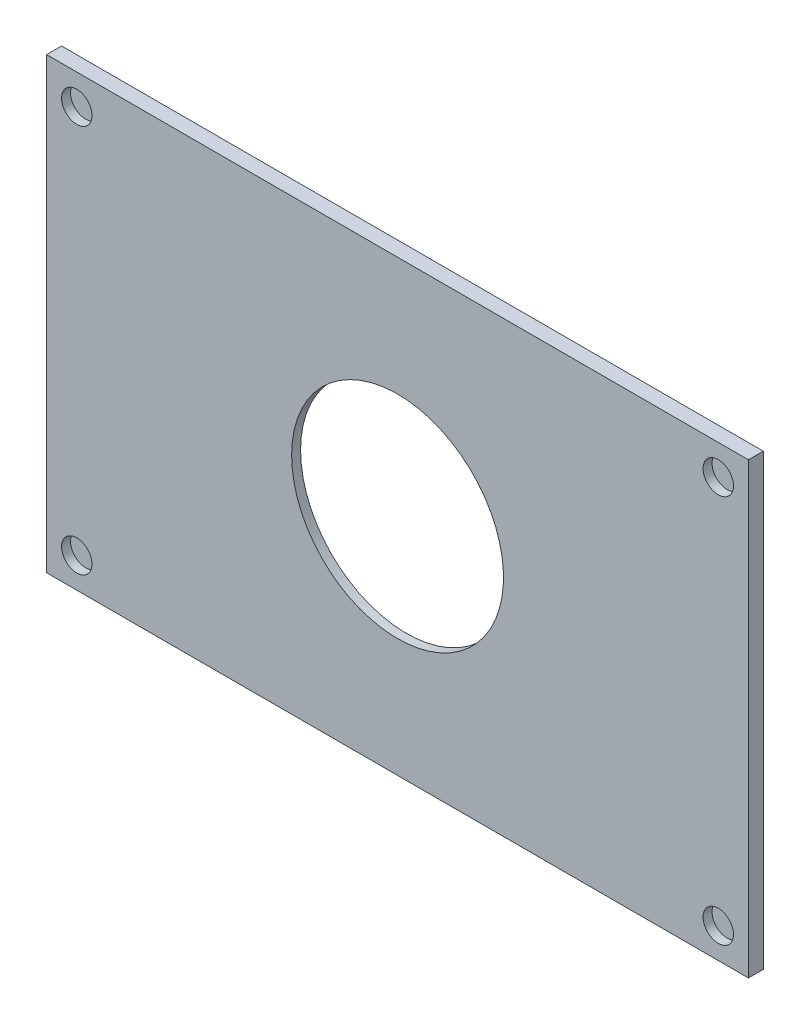
ISO-10303-21;
HEADER;
FILE_DESCRIPTION(('STEP AP214'),'2;1');
FILE_NAME('part.step','',(''),(''),'','','');
FILE_SCHEMA(('AUTOMOTIVE_DESIGN { 1 0 10303 214 1 1 1 1 }'));
ENDSEC;
DATA;
#1=APPLICATION_CONTEXT('core data for automotive mechanical design processes');
#2=APPLICATION_PROTOCOL_DEFINITION('international standard','automotive_design',2000,#1);
#3=PRODUCT_CONTEXT('',#1,'mechanical');
#4=PRODUCT('Part','Part','',(#3));
#5=PRODUCT_RELATED_PRODUCT_CATEGORY('part','',(#4));
#6=PRODUCT_DEFINITION_FORMATION('','',#4);
#7=PRODUCT_DEFINITION_CONTEXT('part definition',#1,'design');
#8=PRODUCT_DEFINITION('design','',#6,#7);
#9=PRODUCT_DEFINITION_SHAPE('','',#8);
#10=(LENGTH_UNIT() NAMED_UNIT(*) SI_UNIT(.MILLI.,.METRE.));
#11=(NAMED_UNIT(*) PLANE_ANGLE_UNIT() SI_UNIT($,.RADIAN.));
#12=(NAMED_UNIT(*) SI_UNIT($,.STERADIAN.) SOLID_ANGLE_UNIT());
#13=UNCERTAINTY_MEASURE_WITH_UNIT(LENGTH_MEASURE(1.E-05),#10,'distance_accuracy_value','');
#14=(GEOMETRIC_REPRESENTATION_CONTEXT(3) GLOBAL_UNCERTAINTY_ASSIGNED_CONTEXT((#13)) GLOBAL_UNIT_ASSIGNED_CONTEXT((#10,
#11,#12)) REPRESENTATION_CONTEXT('',''));
#15=CARTESIAN_POINT('',(0.,0.,0.));
#16=DIRECTION('',(0.,0.,1.));
#17=DIRECTION('',(1.,0.,0.));
#18=AXIS2_PLACEMENT_3D('',#15,#16,#17);
#19=CARTESIAN_POINT('',(0.,0.,0.));
#20=DIRECTION('',(0.,0.,1.));
#21=DIRECTION('',(1.,0.,0.));
#22=AXIS2_PLACEMENT_3D('',#19,#20,#21);
#23=PLANE('',#22);
#24=CARTESIAN_POINT('',(149.352,-95.5039999999999,0.));
#25=DIRECTION('',(0.,0.,1.));
#26=DIRECTION('',(1.,0.,0.));
#27=AXIS2_PLACEMENT_3D('',#24,#25,#26);
#28=CIRCLE('',#27,45.085);
#29=CARTESIAN_POINT('',(104.267,-95.5039999999999,0.));
#30=VERTEX_POINT('',#29);
#31=EDGE_CURVE('E101',#30,#30,#28,.T.);
#32=ORIENTED_EDGE('',*,*,#31,.T.);
#33=EDGE_LOOP('',(#32));
#34=FACE_BOUND('',#33,.T.);
#35=CARTESIAN_POINT('',(149.352,-95.5039999999999,0.));
#36=DIRECTION('',(0.,0.,1.));
#37=DIRECTION('',(1.,0.,0.));
#38=AXIS2_PLACEMENT_3D('',#35,#36,#37);
#39=CIRCLE('',#38,50.165);
#40=CARTESIAN_POINT('',(199.517,-95.5039999999999,0.));
#41=VERTEX_POINT('',#40);
#42=EDGE_CURVE('E95',#41,#41,#39,.T.);
#43=ORIENTED_EDGE('',*,*,#42,.F.);
#44=EDGE_LOOP('',(#43));
#45=FACE_BOUND('',#44,.T.);
#46=ADVANCED_FACE('F33',(#34,#45),#23,.F.);
#47=CARTESIAN_POINT('',(0.,0.,3.81));
#48=DIRECTION('',(0.,0.,1.));
#49=DIRECTION('',(1.,0.,0.));
#50=AXIS2_PLACEMENT_3D('',#47,#48,#49);
#51=PLANE('',#50);
#52=CARTESIAN_POINT('',(12.827,-178.181,3.81));
#53=DIRECTION('',(0.,0.,1.));
#54=DIRECTION('',(1.,0.,0.));
#55=AXIS2_PLACEMENT_3D('',#52,#53,#54);
#56=CIRCLE('',#55,6.477);
#57=CARTESIAN_POINT('',(6.34999999999998,-178.181,3.81));
#58=VERTEX_POINT('',#57);
#59=EDGE_CURVE('E108',#58,#58,#56,.T.);
#60=ORIENTED_EDGE('',*,*,#59,.F.);
#61=EDGE_LOOP('',(#60));
#62=FACE_BOUND('',#61,.T.);
#63=CARTESIAN_POINT('',(285.877,-12.8269999999999,3.81));
#64=DIRECTION('',(0.,0.,1.));
#65=DIRECTION('',(1.,0.,0.));
#66=AXIS2_PLACEMENT_3D('',#63,#64,#65);
#67=CIRCLE('',#66,6.47700000000001);
#68=CARTESIAN_POINT('',(279.4,-12.8269999999999,3.81));
#69=VERTEX_POINT('',#68);
#70=EDGE_CURVE('E120',#69,#69,#67,.T.);
#71=ORIENTED_EDGE('',*,*,#70,.F.);
#72=EDGE_LOOP('',(#71));
#73=FACE_BOUND('',#72,.T.);
#74=DIRECTION('',(0.,-1.,0.));
#75=VECTOR('',#74,1.);
#76=CARTESIAN_POINT('',(0.,0.,3.81));
#77=LINE('',#76,#75);
#78=CARTESIAN_POINT('',(0.,0.,3.81));
#79=VERTEX_POINT('',#78);
#80=CARTESIAN_POINT('',(0.,-191.008,3.81));
#81=VERTEX_POINT('',#80);
#82=EDGE_CURVE('E129',#79,#81,#77,.T.);
#83=ORIENTED_EDGE('',*,*,#82,.T.);
#84=DIRECTION('',(1.,0.,0.));
#85=VECTOR('',#84,1.);
#86=CARTESIAN_POINT('',(0.,-191.008,3.81));
#87=LINE('',#86,#85);
#88=CARTESIAN_POINT('',(298.704,-191.008,3.81));
#89=VERTEX_POINT('',#88);
#90=EDGE_CURVE('E133',#81,#89,#87,.T.);
#91=ORIENTED_EDGE('',*,*,#90,.T.);
#92=DIRECTION('',(0.,1.,0.));
#93=VECTOR('',#92,1.);
#94=CARTESIAN_POINT('',(298.704,0.,3.81));
#95=LINE('',#94,#93);
#96=CARTESIAN_POINT('',(298.704,0.,3.81));
#97=VERTEX_POINT('',#96);
#98=EDGE_CURVE('E53',#89,#97,#95,.T.);
#99=ORIENTED_EDGE('',*,*,#98,.T.);
#100=DIRECTION('',(-1.,0.,0.));
#101=VECTOR('',#100,1.);
#102=CARTESIAN_POINT('',(0.,0.,3.81));
#103=LINE('',#102,#101);
#104=EDGE_CURVE('E48',#97,#79,#103,.T.);
#105=ORIENTED_EDGE('',*,*,#104,.T.);
#106=EDGE_LOOP('',(#83,#91,#99,#105));
#107=FACE_BOUND('',#106,.T.);
#108=CARTESIAN_POINT('',(12.827,-12.827,3.81));
#109=DIRECTION('',(0.,0.,1.));
#110=DIRECTION('',(1.,0.,0.));
#111=AXIS2_PLACEMENT_3D('',#108,#109,#110);
#112=CIRCLE('',#111,6.477);
#113=CARTESIAN_POINT('',(6.34999999999999,-12.827,3.81));
#114=VERTEX_POINT('',#113);
#115=EDGE_CURVE('E126',#114,#114,#112,.T.);
#116=ORIENTED_EDGE('',*,*,#115,.F.);
#117=EDGE_LOOP('',(#116));
#118=FACE_BOUND('',#117,.T.);
#119=CARTESIAN_POINT('',(285.877,-178.181,3.81));
#120=DIRECTION('',(0.,0.,1.));
#121=DIRECTION('',(1.,0.,0.));
#122=AXIS2_PLACEMENT_3D('',#119,#120,#121);
#123=CIRCLE('',#122,6.47700000000001);
#124=CARTESIAN_POINT('',(279.4,-178.181,3.81));
#125=VERTEX_POINT('',#124);
#126=EDGE_CURVE('E114',#125,#125,#123,.T.);
#127=ORIENTED_EDGE('',*,*,#126,.F.);
#128=EDGE_LOOP('',(#127));
#129=FACE_BOUND('',#128,.T.);
#130=CARTESIAN_POINT('',(149.352,-95.5039999999999,3.81));
#131=DIRECTION('',(0.,0.,1.));
#132=DIRECTION('',(1.,0.,0.));
#133=AXIS2_PLACEMENT_3D('',#130,#131,#132);
#134=CIRCLE('',#133,45.085);
#135=CARTESIAN_POINT('',(104.267,-95.5039999999999,3.81));
#136=VERTEX_POINT('',#135);
#137=EDGE_CURVE('E102',#136,#136,#134,.T.);
#138=ORIENTED_EDGE('',*,*,#137,.F.);
#139=EDGE_LOOP('',(#138));
#140=FACE_BOUND('',#139,.T.);
#141=ADVANCED_FACE('F143',(#62,#73,#107,#118,#129,#140),#51,.T.);
#142=CARTESIAN_POINT('',(0.,0.,3.81));
#143=DIRECTION('',(1.,0.,0.));
#144=DIRECTION('',(0.,1.,0.));
#145=AXIS2_PLACEMENT_3D('',#142,#143,#144);
#146=PLANE('',#145);
#147=DIRECTION('',(0.,0.,-1.));
#148=VECTOR('',#147,1.);
#149=CARTESIAN_POINT('',(0.,0.,3.81));
#150=LINE('',#149,#148);
#151=CARTESIAN_POINT('',(0.,0.,-2.54));
#152=VERTEX_POINT('',#151);
#153=EDGE_CURVE('E137',#79,#152,#150,.T.);
#154=ORIENTED_EDGE('',*,*,#153,.T.);
#155=DIRECTION('',(0.,1.,0.));
#156=VECTOR('',#155,1.);
#157=CARTESIAN_POINT('',(0.,-191.008,-2.54));
#158=LINE('',#157,#156);
#159=CARTESIAN_POINT('',(0.,-191.008,-2.54));
#160=VERTEX_POINT('',#159);
#161=EDGE_CURVE('E86',#160,#152,#158,.T.);
#162=ORIENTED_EDGE('',*,*,#161,.F.);
#163=DIRECTION('',(0.,0.,-1.));
#164=VECTOR('',#163,1.);
#165=CARTESIAN_POINT('',(0.,-191.008,3.81));
#166=LINE('',#165,#164);
#167=EDGE_CURVE('E11',#81,#160,#166,.T.);
#168=ORIENTED_EDGE('',*,*,#167,.F.);
#169=ORIENTED_EDGE('',*,*,#82,.F.);
#170=EDGE_LOOP('',(#154,#162,#168,#169));
#171=FACE_BOUND('',#170,.T.);
#172=ADVANCED_FACE('F35',(#171),#146,.F.);
#173=CARTESIAN_POINT('',(0.,-191.008,3.81));
#174=DIRECTION('',(0.,1.,0.));
#175=DIRECTION('',(-1.,0.,0.));
#176=AXIS2_PLACEMENT_3D('',#173,#174,#175);
#177=PLANE('',#176);
#178=ORIENTED_EDGE('',*,*,#167,.T.);
#179=DIRECTION('',(-1.,0.,0.));
#180=VECTOR('',#179,1.);
#181=CARTESIAN_POINT('',(298.704,-191.008,-2.54));
#182=LINE('',#181,#180);
#183=CARTESIAN_POINT('',(298.704,-191.008,-2.54));
#184=VERTEX_POINT('',#183);
#185=EDGE_CURVE('E80',#184,#160,#182,.T.);
#186=ORIENTED_EDGE('',*,*,#185,.F.);
#187=DIRECTION('',(0.,0.,-1.));
#188=VECTOR('',#187,1.);
#189=CARTESIAN_POINT('',(298.704,-191.008,3.81));
#190=LINE('',#189,#188);
#191=EDGE_CURVE('E41',#89,#184,#190,.T.);
#192=ORIENTED_EDGE('',*,*,#191,.F.);
#193=ORIENTED_EDGE('',*,*,#90,.F.);
#194=EDGE_LOOP('',(#178,#186,#192,#193));
#195=FACE_BOUND('',#194,.T.);
#196=ADVANCED_FACE('F81',(#195),#177,.F.);
#197=CARTESIAN_POINT('',(298.704,0.,3.81));
#198=DIRECTION('',(-1.,0.,0.));
#199=DIRECTION('',(0.,-1.,0.));
#200=AXIS2_PLACEMENT_3D('',#197,#198,#199);
#201=PLANE('',#200);
#202=ORIENTED_EDGE('',*,*,#191,.T.);
#203=DIRECTION('',(0.,-1.,0.));
#204=VECTOR('',#203,1.);
#205=CARTESIAN_POINT('',(298.704,-191.008,-2.54));
#206=LINE('',#205,#204);
#207=CARTESIAN_POINT('',(298.704,0.,-2.54));
#208=VERTEX_POINT('',#207);
#209=EDGE_CURVE('E76',#208,#184,#206,.T.);
#210=ORIENTED_EDGE('',*,*,#209,.F.);
#211=DIRECTION('',(0.,0.,-1.));
#212=VECTOR('',#211,1.);
#213=CARTESIAN_POINT('',(298.704,0.,3.81));
#214=LINE('',#213,#212);
#215=EDGE_CURVE('E78',#97,#208,#214,.T.);
#216=ORIENTED_EDGE('',*,*,#215,.F.);
#217=ORIENTED_EDGE('',*,*,#98,.F.);
#218=EDGE_LOOP('',(#202,#210,#216,#217));
#219=FACE_BOUND('',#218,.T.);
#220=ADVANCED_FACE('F74',(#219),#201,.F.);
#221=CARTESIAN_POINT('',(0.,0.,3.81));
#222=DIRECTION('',(0.,-1.,0.));
#223=DIRECTION('',(0.,0.,-1.));
#224=AXIS2_PLACEMENT_3D('',#221,#222,#223);
#225=PLANE('',#224);
#226=ORIENTED_EDGE('',*,*,#215,.T.);
#227=DIRECTION('',(1.,0.,0.));
#228=VECTOR('',#227,1.);
#229=CARTESIAN_POINT('',(298.704,0.,-2.54));
#230=LINE('',#229,#228);
#231=EDGE_CURVE('E91',#152,#208,#230,.T.);
#232=ORIENTED_EDGE('',*,*,#231,.F.);
#233=ORIENTED_EDGE('',*,*,#153,.F.);
#234=ORIENTED_EDGE('',*,*,#104,.F.);
#235=EDGE_LOOP('',(#226,#232,#233,#234));
#236=FACE_BOUND('',#235,.T.);
#237=ADVANCED_FACE('F140',(#236),#225,.F.);
#238=CARTESIAN_POINT('',(12.827,-12.827,3.81));
#239=DIRECTION('',(0.,0.,-1.));
#240=DIRECTION('',(-1.,0.,0.));
#241=AXIS2_PLACEMENT_3D('',#238,#239,#240);
#242=CYLINDRICAL_SURFACE('',#241,6.477);
#243=CARTESIAN_POINT('',(12.827,-12.827,0.));
#244=DIRECTION('',(0.,0.,1.));
#245=DIRECTION('',(1.,0.,0.));
#246=AXIS2_PLACEMENT_3D('',#243,#244,#245);
#247=CIRCLE('',#246,6.477);
#248=CARTESIAN_POINT('',(6.34999999999999,-12.827,0.));
#249=VERTEX_POINT('',#248);
#250=EDGE_CURVE('E123',#249,#249,#247,.T.);
#251=CARTESIAN_POINT('',(6.34999999999999,-12.827,3.81));
#252=CARTESIAN_POINT('',(6.34999999999999,-12.827,3.7703125));
#253=CARTESIAN_POINT('',(6.34999999999999,-12.827,3.730625));
#254=CARTESIAN_POINT('',(6.34999999999999,-12.827,3.65125));
#255=CARTESIAN_POINT('',(6.34999999999999,-12.827,3.6115625));
#256=CARTESIAN_POINT('',(6.34999999999999,-12.827,3.5321875));
#257=CARTESIAN_POINT('',(6.34999999999999,-12.827,3.4925));
#258=CARTESIAN_POINT('',(6.34999999999999,-12.827,3.413125));
#259=CARTESIAN_POINT('',(6.34999999999999,-12.827,3.3734375));
#260=CARTESIAN_POINT('',(6.34999999999999,-12.827,3.2940625));
#261=CARTESIAN_POINT('',(6.34999999999999,-12.827,3.254375));
#262=CARTESIAN_POINT('',(6.34999999999999,-12.827,3.175));
#263=CARTESIAN_POINT('',(6.34999999999999,-12.827,3.1353125));
#264=CARTESIAN_POINT('',(6.34999999999999,-12.827,3.0559375));
#265=CARTESIAN_POINT('',(6.34999999999999,-12.827,3.01625));
#266=CARTESIAN_POINT('',(6.34999999999999,-12.827,2.936875));
#267=CARTESIAN_POINT('',(6.34999999999999,-12.827,2.8971875));
#268=CARTESIAN_POINT('',(6.34999999999999,-12.827,2.8178125));
#269=CARTESIAN_POINT('',(6.34999999999999,-12.827,2.778125));
#270=CARTESIAN_POINT('',(6.34999999999999,-12.827,2.69875));
#271=CARTESIAN_POINT('',(6.34999999999999,-12.827,2.6590625));
#272=CARTESIAN_POINT('',(6.34999999999999,-12.827,2.5796875));
#273=CARTESIAN_POINT('',(6.34999999999999,-12.827,2.54));
#274=CARTESIAN_POINT('',(6.34999999999999,-12.827,2.460625));
#275=CARTESIAN_POINT('',(6.34999999999999,-12.827,2.4209375));
#276=CARTESIAN_POINT('',(6.34999999999999,-12.827,2.3415625));
#277=CARTESIAN_POINT('',(6.34999999999999,-12.827,2.301875));
#278=CARTESIAN_POINT('',(6.34999999999999,-12.827,2.2225));
#279=CARTESIAN_POINT('',(6.34999999999999,-12.827,2.1828125));
#280=CARTESIAN_POINT('',(6.34999999999999,-12.827,2.1034375));
#281=CARTESIAN_POINT('',(6.34999999999999,-12.827,2.06375));
#282=CARTESIAN_POINT('',(6.34999999999999,-12.827,1.984375));
#283=CARTESIAN_POINT('',(6.34999999999999,-12.827,1.9446875));
#284=CARTESIAN_POINT('',(6.34999999999999,-12.827,1.8653125));
#285=CARTESIAN_POINT('',(6.34999999999999,-12.827,1.825625));
#286=CARTESIAN_POINT('',(6.34999999999999,-12.827,1.74625));
#287=CARTESIAN_POINT('',(6.34999999999999,-12.827,1.7065625));
#288=CARTESIAN_POINT('',(6.34999999999999,-12.827,1.6271875));
#289=CARTESIAN_POINT('',(6.34999999999999,-12.827,1.5875));
#290=CARTESIAN_POINT('',(6.34999999999999,-12.827,1.508125));
#291=CARTESIAN_POINT('',(6.34999999999999,-12.827,1.4684375));
#292=CARTESIAN_POINT('',(6.34999999999999,-12.827,1.3890625));
#293=CARTESIAN_POINT('',(6.34999999999999,-12.827,1.349375));
#294=CARTESIAN_POINT('',(6.34999999999999,-12.827,1.27));
#295=CARTESIAN_POINT('',(6.34999999999999,-12.827,1.2303125));
#296=CARTESIAN_POINT('',(6.34999999999999,-12.827,1.1509375));
#297=CARTESIAN_POINT('',(6.34999999999999,-12.827,1.11125));
#298=CARTESIAN_POINT('',(6.34999999999999,-12.827,1.031875));
#299=CARTESIAN_POINT('',(6.34999999999999,-12.827,0.9921875));
#300=CARTESIAN_POINT('',(6.34999999999999,-12.827,0.9128125));
#301=CARTESIAN_POINT('',(6.34999999999999,-12.827,0.873125));
#302=CARTESIAN_POINT('',(6.34999999999999,-12.827,0.79375));
#303=CARTESIAN_POINT('',(6.34999999999999,-12.827,0.7540625));
#304=CARTESIAN_POINT('',(6.34999999999999,-12.827,0.6746875));
#305=CARTESIAN_POINT('',(6.34999999999999,-12.827,0.635));
#306=CARTESIAN_POINT('',(6.34999999999999,-12.827,0.555625));
#307=CARTESIAN_POINT('',(6.34999999999999,-12.827,0.5159375));
#308=CARTESIAN_POINT('',(6.34999999999999,-12.827,0.4365625));
#309=CARTESIAN_POINT('',(6.34999999999999,-12.827,0.396875));
#310=CARTESIAN_POINT('',(6.34999999999999,-12.827,0.3175));
#311=CARTESIAN_POINT('',(6.34999999999999,-12.827,0.2778125));
#312=CARTESIAN_POINT('',(6.34999999999999,-12.827,0.1984375));
#313=CARTESIAN_POINT('',(6.34999999999999,-12.827,0.15875));
#314=CARTESIAN_POINT('',(6.34999999999999,-12.827,0.0793749999999999));
#315=CARTESIAN_POINT('',(6.34999999999999,-12.827,0.0396874999999999));
#316=CARTESIAN_POINT('',(6.34999999999999,-12.827,0.));
#317=B_SPLINE_CURVE_WITH_KNOTS('',3,(#251,#252,#253,#254,#255,#256,#257,#258,#259,#260,#261,
#262,#263,#264,#265,#266,#267,#268,#269,#270,#271,#272,#273,#274,#275,#276,#277,#278,#279,#280,
#281,#282,#283,#284,#285,#286,#287,#288,#289,#290,#291,#292,#293,#294,#295,#296,#297,#298,#299,
#300,#301,#302,#303,#304,#305,#306,#307,#308,#309,#310,#311,#312,#313,#314,#315,#316),
.UNSPECIFIED.,.F.,.F.,(4,2,2,2,2,2,2,2,2,2,2,2,2,2,2,2,2,2,2,2,2,2,2,2,2,2,2,2,2,2,2,2,4),(0.,
0.1190625,0.238125,0.3571875,0.47625,0.5953125,0.714375,0.8334375,0.9525,1.0715625,1.190625,
1.3096875,1.42875,1.5478125,1.666875,1.7859375,1.905,2.0240625,2.143125,2.2621875,2.38125,
2.5003125,2.619375,2.7384375,2.8575,2.9765625,3.095625,3.2146875,3.33375,3.4528125,3.571875,
3.6909375,3.81),.UNSPECIFIED.);
#318=EDGE_CURVE('BSEAM194',#114,#249,#317,.T.);
#319=ORIENTED_EDGE('',*,*,#115,.T.);
#320=ORIENTED_EDGE('',*,*,#250,.F.);
#321=ORIENTED_EDGE('',*,*,#318,.T.);
#322=ORIENTED_EDGE('',*,*,#318,.F.);
#323=EDGE_LOOP('',(#319,#321,#320,#322));
#324=FACE_BOUND('',#323,.T.);
#325=ADVANCED_FACE('F194',(#324),#242,.F.);
#326=CARTESIAN_POINT('',(285.877,-12.8269999999999,3.81));
#327=DIRECTION('',(0.,0.,-1.));
#328=DIRECTION('',(-1.,0.,0.));
#329=AXIS2_PLACEMENT_3D('',#326,#327,#328);
#330=CYLINDRICAL_SURFACE('',#329,6.47700000000001);
#331=CARTESIAN_POINT('',(285.877,-12.8269999999999,0.));
#332=DIRECTION('',(0.,0.,1.));
#333=DIRECTION('',(1.,0.,0.));
#334=AXIS2_PLACEMENT_3D('',#331,#332,#333);
#335=CIRCLE('',#334,6.47700000000001);
#336=CARTESIAN_POINT('',(279.4,-12.8269999999999,0.));
#337=VERTEX_POINT('',#336);
#338=EDGE_CURVE('E117',#337,#337,#335,.T.);
#339=CARTESIAN_POINT('',(279.4,-12.8269999999999,3.81));
#340=CARTESIAN_POINT('',(279.4,-12.8269999999999,3.7703125));
#341=CARTESIAN_POINT('',(279.4,-12.8269999999999,3.730625));
#342=CARTESIAN_POINT('',(279.4,-12.8269999999999,3.65125));
#343=CARTESIAN_POINT('',(279.4,-12.8269999999999,3.6115625));
#344=CARTESIAN_POINT('',(279.4,-12.8269999999999,3.5321875));
#345=CARTESIAN_POINT('',(279.4,-12.8269999999999,3.4925));
#346=CARTESIAN_POINT('',(279.4,-12.8269999999999,3.413125));
#347=CARTESIAN_POINT('',(279.4,-12.8269999999999,3.3734375));
#348=CARTESIAN_POINT('',(279.4,-12.8269999999999,3.2940625));
#349=CARTESIAN_POINT('',(279.4,-12.8269999999999,3.254375));
#350=CARTESIAN_POINT('',(279.4,-12.8269999999999,3.175));
#351=CARTESIAN_POINT('',(279.4,-12.8269999999999,3.1353125));
#352=CARTESIAN_POINT('',(279.4,-12.8269999999999,3.0559375));
#353=CARTESIAN_POINT('',(279.4,-12.8269999999999,3.01625));
#354=CARTESIAN_POINT('',(279.4,-12.8269999999999,2.936875));
#355=CARTESIAN_POINT('',(279.4,-12.8269999999999,2.8971875));
#356=CARTESIAN_POINT('',(279.4,-12.8269999999999,2.8178125));
#357=CARTESIAN_POINT('',(279.4,-12.8269999999999,2.778125));
#358=CARTESIAN_POINT('',(279.4,-12.8269999999999,2.69875));
#359=CARTESIAN_POINT('',(279.4,-12.8269999999999,2.6590625));
#360=CARTESIAN_POINT('',(279.4,-12.8269999999999,2.5796875));
#361=CARTESIAN_POINT('',(279.4,-12.8269999999999,2.54));
#362=CARTESIAN_POINT('',(279.4,-12.8269999999999,2.460625));
#363=CARTESIAN_POINT('',(279.4,-12.8269999999999,2.4209375));
#364=CARTESIAN_POINT('',(279.4,-12.8269999999999,2.3415625));
#365=CARTESIAN_POINT('',(279.4,-12.8269999999999,2.301875));
#366=CARTESIAN_POINT('',(279.4,-12.8269999999999,2.2225));
#367=CARTESIAN_POINT('',(279.4,-12.8269999999999,2.1828125));
#368=CARTESIAN_POINT('',(279.4,-12.8269999999999,2.1034375));
#369=CARTESIAN_POINT('',(279.4,-12.8269999999999,2.06375));
#370=CARTESIAN_POINT('',(279.4,-12.8269999999999,1.984375));
#371=CARTESIAN_POINT('',(279.4,-12.8269999999999,1.9446875));
#372=CARTESIAN_POINT('',(279.4,-12.8269999999999,1.8653125));
#373=CARTESIAN_POINT('',(279.4,-12.8269999999999,1.825625));
#374=CARTESIAN_POINT('',(279.4,-12.8269999999999,1.74625));
#375=CARTESIAN_POINT('',(279.4,-12.8269999999999,1.7065625));
#376=CARTESIAN_POINT('',(279.4,-12.8269999999999,1.6271875));
#377=CARTESIAN_POINT('',(279.4,-12.8269999999999,1.5875));
#378=CARTESIAN_POINT('',(279.4,-12.8269999999999,1.508125));
#379=CARTESIAN_POINT('',(279.4,-12.8269999999999,1.4684375));
#380=CARTESIAN_POINT('',(279.4,-12.8269999999999,1.3890625));
#381=CARTESIAN_POINT('',(279.4,-12.8269999999999,1.349375));
#382=CARTESIAN_POINT('',(279.4,-12.8269999999999,1.27));
#383=CARTESIAN_POINT('',(279.4,-12.8269999999999,1.2303125));
#384=CARTESIAN_POINT('',(279.4,-12.8269999999999,1.1509375));
#385=CARTESIAN_POINT('',(279.4,-12.8269999999999,1.11125));
#386=CARTESIAN_POINT('',(279.4,-12.8269999999999,1.031875));
#387=CARTESIAN_POINT('',(279.4,-12.8269999999999,0.9921875));
#388=CARTESIAN_POINT('',(279.4,-12.8269999999999,0.9128125));
#389=CARTESIAN_POINT('',(279.4,-12.8269999999999,0.873125));
#390=CARTESIAN_POINT('',(279.4,-12.8269999999999,0.79375));
#391=CARTESIAN_POINT('',(279.4,-12.8269999999999,0.7540625));
#392=CARTESIAN_POINT('',(279.4,-12.8269999999999,0.6746875));
#393=CARTESIAN_POINT('',(279.4,-12.8269999999999,0.635));
#394=CARTESIAN_POINT('',(279.4,-12.8269999999999,0.555625));
#395=CARTESIAN_POINT('',(279.4,-12.8269999999999,0.5159375));
#396=CARTESIAN_POINT('',(279.4,-12.8269999999999,0.4365625));
#397=CARTESIAN_POINT('',(279.4,-12.8269999999999,0.396875));
#398=CARTESIAN_POINT('',(279.4,-12.8269999999999,0.3175));
#399=CARTESIAN_POINT('',(279.4,-12.8269999999999,0.2778125));
#400=CARTESIAN_POINT('',(279.4,-12.8269999999999,0.1984375));
#401=CARTESIAN_POINT('',(279.4,-12.8269999999999,0.15875));
#402=CARTESIAN_POINT('',(279.4,-12.8269999999999,0.0793749999999999));
#403=CARTESIAN_POINT('',(279.4,-12.8269999999999,0.0396874999999999));
#404=CARTESIAN_POINT('',(279.4,-12.8269999999999,0.));
#405=B_SPLINE_CURVE_WITH_KNOTS('',3,(#339,#340,#341,#342,#343,#344,#345,#346,#347,#348,#349,
#350,#351,#352,#353,#354,#355,#356,#357,#358,#359,#360,#361,#362,#363,#364,#365,#366,#367,#368,
#369,#370,#371,#372,#373,#374,#375,#376,#377,#378,#379,#380,#381,#382,#383,#384,#385,#386,#387,
#388,#389,#390,#391,#392,#393,#394,#395,#396,#397,#398,#399,#400,#401,#402,#403,#404),
.UNSPECIFIED.,.F.,.F.,(4,2,2,2,2,2,2,2,2,2,2,2,2,2,2,2,2,2,2,2,2,2,2,2,2,2,2,2,2,2,2,2,4),(0.,
0.1190625,0.238125,0.3571875,0.47625,0.5953125,0.714375,0.8334375,0.9525,1.0715625,1.190625,
1.3096875,1.42875,1.5478125,1.666875,1.7859375,1.905,2.0240625,2.143125,2.2621875,2.38125,
2.5003125,2.619375,2.7384375,2.8575,2.9765625,3.095625,3.2146875,3.33375,3.4528125,3.571875,
3.6909375,3.81),.UNSPECIFIED.);
#406=EDGE_CURVE('BSEAM190',#69,#337,#405,.T.);
#407=ORIENTED_EDGE('',*,*,#70,.T.);
#408=ORIENTED_EDGE('',*,*,#338,.F.);
#409=ORIENTED_EDGE('',*,*,#406,.T.);
#410=ORIENTED_EDGE('',*,*,#406,.F.);
#411=EDGE_LOOP('',(#407,#409,#408,#410));
#412=FACE_BOUND('',#411,.T.);
#413=ADVANCED_FACE('F190',(#412),#330,.F.);
#414=CARTESIAN_POINT('',(285.877,-178.181,3.81));
#415=DIRECTION('',(0.,0.,-1.));
#416=DIRECTION('',(-1.,0.,0.));
#417=AXIS2_PLACEMENT_3D('',#414,#415,#416);
#418=CYLINDRICAL_SURFACE('',#417,6.47700000000001);
#419=CARTESIAN_POINT('',(285.877,-178.181,0.));
#420=DIRECTION('',(0.,0.,1.));
#421=DIRECTION('',(1.,0.,0.));
#422=AXIS2_PLACEMENT_3D('',#419,#420,#421);
#423=CIRCLE('',#422,6.47700000000001);
#424=CARTESIAN_POINT('',(279.4,-178.181,0.));
#425=VERTEX_POINT('',#424);
#426=EDGE_CURVE('E111',#425,#425,#423,.T.);
#427=CARTESIAN_POINT('',(279.4,-178.181,3.81));
#428=CARTESIAN_POINT('',(279.4,-178.181,3.7703125));
#429=CARTESIAN_POINT('',(279.4,-178.181,3.730625));
#430=CARTESIAN_POINT('',(279.4,-178.181,3.65125));
#431=CARTESIAN_POINT('',(279.4,-178.181,3.6115625));
#432=CARTESIAN_POINT('',(279.4,-178.181,3.5321875));
#433=CARTESIAN_POINT('',(279.4,-178.181,3.4925));
#434=CARTESIAN_POINT('',(279.4,-178.181,3.413125));
#435=CARTESIAN_POINT('',(279.4,-178.181,3.3734375));
#436=CARTESIAN_POINT('',(279.4,-178.181,3.2940625));
#437=CARTESIAN_POINT('',(279.4,-178.181,3.254375));
#438=CARTESIAN_POINT('',(279.4,-178.181,3.175));
#439=CARTESIAN_POINT('',(279.4,-178.181,3.1353125));
#440=CARTESIAN_POINT('',(279.4,-178.181,3.0559375));
#441=CARTESIAN_POINT('',(279.4,-178.181,3.01625));
#442=CARTESIAN_POINT('',(279.4,-178.181,2.936875));
#443=CARTESIAN_POINT('',(279.4,-178.181,2.8971875));
#444=CARTESIAN_POINT('',(279.4,-178.181,2.8178125));
#445=CARTESIAN_POINT('',(279.4,-178.181,2.778125));
#446=CARTESIAN_POINT('',(279.4,-178.181,2.69875));
#447=CARTESIAN_POINT('',(279.4,-178.181,2.6590625));
#448=CARTESIAN_POINT('',(279.4,-178.181,2.5796875));
#449=CARTESIAN_POINT('',(279.4,-178.181,2.54));
#450=CARTESIAN_POINT('',(279.4,-178.181,2.460625));
#451=CARTESIAN_POINT('',(279.4,-178.181,2.4209375));
#452=CARTESIAN_POINT('',(279.4,-178.181,2.3415625));
#453=CARTESIAN_POINT('',(279.4,-178.181,2.301875));
#454=CARTESIAN_POINT('',(279.4,-178.181,2.2225));
#455=CARTESIAN_POINT('',(279.4,-178.181,2.1828125));
#456=CARTESIAN_POINT('',(279.4,-178.181,2.1034375));
#457=CARTESIAN_POINT('',(279.4,-178.181,2.06375));
#458=CARTESIAN_POINT('',(279.4,-178.181,1.984375));
#459=CARTESIAN_POINT('',(279.4,-178.181,1.9446875));
#460=CARTESIAN_POINT('',(279.4,-178.181,1.8653125));
#461=CARTESIAN_POINT('',(279.4,-178.181,1.825625));
#462=CARTESIAN_POINT('',(279.4,-178.181,1.74625));
#463=CARTESIAN_POINT('',(279.4,-178.181,1.7065625));
#464=CARTESIAN_POINT('',(279.4,-178.181,1.6271875));
#465=CARTESIAN_POINT('',(279.4,-178.181,1.5875));
#466=CARTESIAN_POINT('',(279.4,-178.181,1.508125));
#467=CARTESIAN_POINT('',(279.4,-178.181,1.4684375));
#468=CARTESIAN_POINT('',(279.4,-178.181,1.3890625));
#469=CARTESIAN_POINT('',(279.4,-178.181,1.349375));
#470=CARTESIAN_POINT('',(279.4,-178.181,1.27));
#471=CARTESIAN_POINT('',(279.4,-178.181,1.2303125));
#472=CARTESIAN_POINT('',(279.4,-178.181,1.1509375));
#473=CARTESIAN_POINT('',(279.4,-178.181,1.11125));
#474=CARTESIAN_POINT('',(279.4,-178.181,1.031875));
#475=CARTESIAN_POINT('',(279.4,-178.181,0.9921875));
#476=CARTESIAN_POINT('',(279.4,-178.181,0.9128125));
#477=CARTESIAN_POINT('',(279.4,-178.181,0.873125));
#478=CARTESIAN_POINT('',(279.4,-178.181,0.79375));
#479=CARTESIAN_POINT('',(279.4,-178.181,0.7540625));
#480=CARTESIAN_POINT('',(279.4,-178.181,0.6746875));
#481=CARTESIAN_POINT('',(279.4,-178.181,0.635));
#482=CARTESIAN_POINT('',(279.4,-178.181,0.555625));
#483=CARTESIAN_POINT('',(279.4,-178.181,0.5159375));
#484=CARTESIAN_POINT('',(279.4,-178.181,0.4365625));
#485=CARTESIAN_POINT('',(279.4,-178.181,0.396875));
#486=CARTESIAN_POINT('',(279.4,-178.181,0.3175));
#487=CARTESIAN_POINT('',(279.4,-178.181,0.2778125));
#488=CARTESIAN_POINT('',(279.4,-178.181,0.1984375));
#489=CARTESIAN_POINT('',(279.4,-178.181,0.15875));
#490=CARTESIAN_POINT('',(279.4,-178.181,0.0793749999999999));
#491=CARTESIAN_POINT('',(279.4,-178.181,0.0396874999999999));
#492=CARTESIAN_POINT('',(279.4,-178.181,0.));
#493=B_SPLINE_CURVE_WITH_KNOTS('',3,(#427,#428,#429,#430,#431,#432,#433,#434,#435,#436,#437,
#438,#439,#440,#441,#442,#443,#444,#445,#446,#447,#448,#449,#450,#451,#452,#453,#454,#455,#456,
#457,#458,#459,#460,#461,#462,#463,#464,#465,#466,#467,#468,#469,#470,#471,#472,#473,#474,#475,
#476,#477,#478,#479,#480,#481,#482,#483,#484,#485,#486,#487,#488,#489,#490,#491,#492),
.UNSPECIFIED.,.F.,.F.,(4,2,2,2,2,2,2,2,2,2,2,2,2,2,2,2,2,2,2,2,2,2,2,2,2,2,2,2,2,2,2,2,4),(0.,
0.1190625,0.238125,0.3571875,0.47625,0.5953125,0.714375,0.8334375,0.9525,1.0715625,1.190625,
1.3096875,1.42875,1.5478125,1.666875,1.7859375,1.905,2.0240625,2.143125,2.2621875,2.38125,
2.5003125,2.619375,2.7384375,2.8575,2.9765625,3.095625,3.2146875,3.33375,3.4528125,3.571875,
3.6909375,3.81),.UNSPECIFIED.);
#494=EDGE_CURVE('BSEAM186',#125,#425,#493,.T.);
#495=ORIENTED_EDGE('',*,*,#126,.T.);
#496=ORIENTED_EDGE('',*,*,#426,.F.);
#497=ORIENTED_EDGE('',*,*,#494,.T.);
#498=ORIENTED_EDGE('',*,*,#494,.F.);
#499=EDGE_LOOP('',(#495,#497,#496,#498));
#500=FACE_BOUND('',#499,.T.);
#501=ADVANCED_FACE('F186',(#500),#418,.F.);
#502=CARTESIAN_POINT('',(12.827,-178.181,3.81));
#503=DIRECTION('',(0.,0.,-1.));
#504=DIRECTION('',(-1.,0.,0.));
#505=AXIS2_PLACEMENT_3D('',#502,#503,#504);
#506=CYLINDRICAL_SURFACE('',#505,6.477);
#507=CARTESIAN_POINT('',(12.827,-178.181,0.));
#508=DIRECTION('',(0.,0.,1.));
#509=DIRECTION('',(1.,0.,0.));
#510=AXIS2_PLACEMENT_3D('',#507,#508,#509);
#511=CIRCLE('',#510,6.477);
#512=CARTESIAN_POINT('',(6.34999999999998,-178.181,0.));
#513=VERTEX_POINT('',#512);
#514=EDGE_CURVE('E105',#513,#513,#511,.T.);
#515=CARTESIAN_POINT('',(6.34999999999998,-178.181,3.81));
#516=CARTESIAN_POINT('',(6.34999999999998,-178.181,3.7703125));
#517=CARTESIAN_POINT('',(6.34999999999998,-178.181,3.730625));
#518=CARTESIAN_POINT('',(6.34999999999998,-178.181,3.65125));
#519=CARTESIAN_POINT('',(6.34999999999998,-178.181,3.6115625));
#520=CARTESIAN_POINT('',(6.34999999999998,-178.181,3.5321875));
#521=CARTESIAN_POINT('',(6.34999999999998,-178.181,3.4925));
#522=CARTESIAN_POINT('',(6.34999999999998,-178.181,3.413125));
#523=CARTESIAN_POINT('',(6.34999999999998,-178.181,3.3734375));
#524=CARTESIAN_POINT('',(6.34999999999998,-178.181,3.2940625));
#525=CARTESIAN_POINT('',(6.34999999999998,-178.181,3.254375));
#526=CARTESIAN_POINT('',(6.34999999999998,-178.181,3.175));
#527=CARTESIAN_POINT('',(6.34999999999998,-178.181,3.1353125));
#528=CARTESIAN_POINT('',(6.34999999999998,-178.181,3.0559375));
#529=CARTESIAN_POINT('',(6.34999999999998,-178.181,3.01625));
#530=CARTESIAN_POINT('',(6.34999999999998,-178.181,2.936875));
#531=CARTESIAN_POINT('',(6.34999999999998,-178.181,2.8971875));
#532=CARTESIAN_POINT('',(6.34999999999998,-178.181,2.8178125));
#533=CARTESIAN_POINT('',(6.34999999999998,-178.181,2.778125));
#534=CARTESIAN_POINT('',(6.34999999999998,-178.181,2.69875));
#535=CARTESIAN_POINT('',(6.34999999999998,-178.181,2.6590625));
#536=CARTESIAN_POINT('',(6.34999999999998,-178.181,2.5796875));
#537=CARTESIAN_POINT('',(6.34999999999998,-178.181,2.54));
#538=CARTESIAN_POINT('',(6.34999999999998,-178.181,2.460625));
#539=CARTESIAN_POINT('',(6.34999999999998,-178.181,2.4209375));
#540=CARTESIAN_POINT('',(6.34999999999998,-178.181,2.3415625));
#541=CARTESIAN_POINT('',(6.34999999999998,-178.181,2.301875));
#542=CARTESIAN_POINT('',(6.34999999999998,-178.181,2.2225));
#543=CARTESIAN_POINT('',(6.34999999999998,-178.181,2.1828125));
#544=CARTESIAN_POINT('',(6.34999999999998,-178.181,2.1034375));
#545=CARTESIAN_POINT('',(6.34999999999998,-178.181,2.06375));
#546=CARTESIAN_POINT('',(6.34999999999998,-178.181,1.984375));
#547=CARTESIAN_POINT('',(6.34999999999998,-178.181,1.9446875));
#548=CARTESIAN_POINT('',(6.34999999999998,-178.181,1.8653125));
#549=CARTESIAN_POINT('',(6.34999999999998,-178.181,1.825625));
#550=CARTESIAN_POINT('',(6.34999999999998,-178.181,1.74625));
#551=CARTESIAN_POINT('',(6.34999999999998,-178.181,1.7065625));
#552=CARTESIAN_POINT('',(6.34999999999998,-178.181,1.6271875));
#553=CARTESIAN_POINT('',(6.34999999999998,-178.181,1.5875));
#554=CARTESIAN_POINT('',(6.34999999999998,-178.181,1.508125));
#555=CARTESIAN_POINT('',(6.34999999999998,-178.181,1.4684375));
#556=CARTESIAN_POINT('',(6.34999999999998,-178.181,1.3890625));
#557=CARTESIAN_POINT('',(6.34999999999998,-178.181,1.349375));
#558=CARTESIAN_POINT('',(6.34999999999998,-178.181,1.27));
#559=CARTESIAN_POINT('',(6.34999999999998,-178.181,1.2303125));
#560=CARTESIAN_POINT('',(6.34999999999998,-178.181,1.1509375));
#561=CARTESIAN_POINT('',(6.34999999999998,-178.181,1.11125));
#562=CARTESIAN_POINT('',(6.34999999999998,-178.181,1.031875));
#563=CARTESIAN_POINT('',(6.34999999999998,-178.181,0.9921875));
#564=CARTESIAN_POINT('',(6.34999999999998,-178.181,0.9128125));
#565=CARTESIAN_POINT('',(6.34999999999998,-178.181,0.873125));
#566=CARTESIAN_POINT('',(6.34999999999998,-178.181,0.79375));
#567=CARTESIAN_POINT('',(6.34999999999998,-178.181,0.7540625));
#568=CARTESIAN_POINT('',(6.34999999999998,-178.181,0.6746875));
#569=CARTESIAN_POINT('',(6.34999999999998,-178.181,0.635));
#570=CARTESIAN_POINT('',(6.34999999999998,-178.181,0.555625));
#571=CARTESIAN_POINT('',(6.34999999999998,-178.181,0.5159375));
#572=CARTESIAN_POINT('',(6.34999999999998,-178.181,0.4365625));
#573=CARTESIAN_POINT('',(6.34999999999998,-178.181,0.396875));
#574=CARTESIAN_POINT('',(6.34999999999998,-178.181,0.3175));
#575=CARTESIAN_POINT('',(6.34999999999998,-178.181,0.2778125));
#576=CARTESIAN_POINT('',(6.34999999999998,-178.181,0.1984375));
#577=CARTESIAN_POINT('',(6.34999999999998,-178.181,0.15875));
#578=CARTESIAN_POINT('',(6.34999999999998,-178.181,0.0793749999999999));
#579=CARTESIAN_POINT('',(6.34999999999998,-178.181,0.0396874999999999));
#580=CARTESIAN_POINT('',(6.34999999999998,-178.181,0.));
#581=B_SPLINE_CURVE_WITH_KNOTS('',3,(#515,#516,#517,#518,#519,#520,#521,#522,#523,#524,#525,
#526,#527,#528,#529,#530,#531,#532,#533,#534,#535,#536,#537,#538,#539,#540,#541,#542,#543,#544,
#545,#546,#547,#548,#549,#550,#551,#552,#553,#554,#555,#556,#557,#558,#559,#560,#561,#562,#563,
#564,#565,#566,#567,#568,#569,#570,#571,#572,#573,#574,#575,#576,#577,#578,#579,#580),
.UNSPECIFIED.,.F.,.F.,(4,2,2,2,2,2,2,2,2,2,2,2,2,2,2,2,2,2,2,2,2,2,2,2,2,2,2,2,2,2,2,2,4),(0.,
0.1190625,0.238125,0.3571875,0.47625,0.5953125,0.714375,0.8334375,0.9525,1.0715625,1.190625,
1.3096875,1.42875,1.5478125,1.666875,1.7859375,1.905,2.0240625,2.143125,2.2621875,2.38125,
2.5003125,2.619375,2.7384375,2.8575,2.9765625,3.095625,3.2146875,3.33375,3.4528125,3.571875,
3.6909375,3.81),.UNSPECIFIED.);
#582=EDGE_CURVE('BSEAM158',#58,#513,#581,.T.);
#583=ORIENTED_EDGE('',*,*,#59,.T.);
#584=ORIENTED_EDGE('',*,*,#514,.F.);
#585=ORIENTED_EDGE('',*,*,#582,.T.);
#586=ORIENTED_EDGE('',*,*,#582,.F.);
#587=EDGE_LOOP('',(#583,#585,#584,#586));
#588=FACE_BOUND('',#587,.T.);
#589=ADVANCED_FACE('F158',(#588),#506,.F.);
#590=CARTESIAN_POINT('',(149.352,-95.5039999999999,3.81));
#591=DIRECTION('',(0.,0.,-1.));
#592=DIRECTION('',(-1.,0.,0.));
#593=AXIS2_PLACEMENT_3D('',#590,#591,#592);
#594=CYLINDRICAL_SURFACE('',#593,45.085);
#595=CARTESIAN_POINT('',(104.267,-95.5039999999999,3.81));
#596=CARTESIAN_POINT('',(104.267,-95.5039999999999,3.7703125));
#597=CARTESIAN_POINT('',(104.267,-95.5039999999999,3.730625));
#598=CARTESIAN_POINT('',(104.267,-95.5039999999999,3.65125));
#599=CARTESIAN_POINT('',(104.267,-95.5039999999999,3.6115625));
#600=CARTESIAN_POINT('',(104.267,-95.5039999999999,3.5321875));
#601=CARTESIAN_POINT('',(104.267,-95.5039999999999,3.4925));
#602=CARTESIAN_POINT('',(104.267,-95.5039999999999,3.413125));
#603=CARTESIAN_POINT('',(104.267,-95.5039999999999,3.3734375));
#604=CARTESIAN_POINT('',(104.267,-95.5039999999999,3.2940625));
#605=CARTESIAN_POINT('',(104.267,-95.5039999999999,3.254375));
#606=CARTESIAN_POINT('',(104.267,-95.5039999999999,3.175));
#607=CARTESIAN_POINT('',(104.267,-95.5039999999999,3.1353125));
#608=CARTESIAN_POINT('',(104.267,-95.5039999999999,3.0559375));
#609=CARTESIAN_POINT('',(104.267,-95.5039999999999,3.01625));
#610=CARTESIAN_POINT('',(104.267,-95.5039999999999,2.936875));
#611=CARTESIAN_POINT('',(104.267,-95.5039999999999,2.8971875));
#612=CARTESIAN_POINT('',(104.267,-95.5039999999999,2.8178125));
#613=CARTESIAN_POINT('',(104.267,-95.5039999999999,2.778125));
#614=CARTESIAN_POINT('',(104.267,-95.5039999999999,2.69875));
#615=CARTESIAN_POINT('',(104.267,-95.5039999999999,2.6590625));
#616=CARTESIAN_POINT('',(104.267,-95.5039999999999,2.5796875));
#617=CARTESIAN_POINT('',(104.267,-95.5039999999999,2.54));
#618=CARTESIAN_POINT('',(104.267,-95.5039999999999,2.460625));
#619=CARTESIAN_POINT('',(104.267,-95.5039999999999,2.4209375));
#620=CARTESIAN_POINT('',(104.267,-95.5039999999999,2.3415625));
#621=CARTESIAN_POINT('',(104.267,-95.5039999999999,2.301875));
#622=CARTESIAN_POINT('',(104.267,-95.5039999999999,2.2225));
#623=CARTESIAN_POINT('',(104.267,-95.5039999999999,2.1828125));
#624=CARTESIAN_POINT('',(104.267,-95.5039999999999,2.1034375));
#625=CARTESIAN_POINT('',(104.267,-95.5039999999999,2.06375));
#626=CARTESIAN_POINT('',(104.267,-95.5039999999999,1.984375));
#627=CARTESIAN_POINT('',(104.267,-95.5039999999999,1.9446875));
#628=CARTESIAN_POINT('',(104.267,-95.5039999999999,1.8653125));
#629=CARTESIAN_POINT('',(104.267,-95.5039999999999,1.825625));
#630=CARTESIAN_POINT('',(104.267,-95.5039999999999,1.74625));
#631=CARTESIAN_POINT('',(104.267,-95.5039999999999,1.7065625));
#632=CARTESIAN_POINT('',(104.267,-95.5039999999999,1.6271875));
#633=CARTESIAN_POINT('',(104.267,-95.5039999999999,1.5875));
#634=CARTESIAN_POINT('',(104.267,-95.5039999999999,1.508125));
#635=CARTESIAN_POINT('',(104.267,-95.5039999999999,1.4684375));
#636=CARTESIAN_POINT('',(104.267,-95.5039999999999,1.3890625));
#637=CARTESIAN_POINT('',(104.267,-95.5039999999999,1.349375));
#638=CARTESIAN_POINT('',(104.267,-95.5039999999999,1.27));
#639=CARTESIAN_POINT('',(104.267,-95.5039999999999,1.2303125));
#640=CARTESIAN_POINT('',(104.267,-95.5039999999999,1.1509375));
#641=CARTESIAN_POINT('',(104.267,-95.5039999999999,1.11125));
#642=CARTESIAN_POINT('',(104.267,-95.5039999999999,1.031875));
#643=CARTESIAN_POINT('',(104.267,-95.5039999999999,0.9921875));
#644=CARTESIAN_POINT('',(104.267,-95.5039999999999,0.9128125));
#645=CARTESIAN_POINT('',(104.267,-95.5039999999999,0.873125));
#646=CARTESIAN_POINT('',(104.267,-95.5039999999999,0.79375));
#647=CARTESIAN_POINT('',(104.267,-95.5039999999999,0.7540625));
#648=CARTESIAN_POINT('',(104.267,-95.5039999999999,0.6746875));
#649=CARTESIAN_POINT('',(104.267,-95.5039999999999,0.635));
#650=CARTESIAN_POINT('',(104.267,-95.5039999999999,0.555625));
#651=CARTESIAN_POINT('',(104.267,-95.5039999999999,0.5159375));
#652=CARTESIAN_POINT('',(104.267,-95.5039999999999,0.4365625));
#653=CARTESIAN_POINT('',(104.267,-95.5039999999999,0.396875));
#654=CARTESIAN_POINT('',(104.267,-95.5039999999999,0.3175));
#655=CARTESIAN_POINT('',(104.267,-95.5039999999999,0.2778125));
#656=CARTESIAN_POINT('',(104.267,-95.5039999999999,0.1984375));
#657=CARTESIAN_POINT('',(104.267,-95.5039999999999,0.15875));
#658=CARTESIAN_POINT('',(104.267,-95.5039999999999,0.0793749999999999));
#659=CARTESIAN_POINT('',(104.267,-95.5039999999999,0.0396874999999999));
#660=CARTESIAN_POINT('',(104.267,-95.5039999999999,0.));
#661=B_SPLINE_CURVE_WITH_KNOTS('',3,(#595,#596,#597,#598,#599,#600,#601,#602,#603,#604,#605,
#606,#607,#608,#609,#610,#611,#612,#613,#614,#615,#616,#617,#618,#619,#620,#621,#622,#623,#624,
#625,#626,#627,#628,#629,#630,#631,#632,#633,#634,#635,#636,#637,#638,#639,#640,#641,#642,#643,
#644,#645,#646,#647,#648,#649,#650,#651,#652,#653,#654,#655,#656,#657,#658,#659,#660),
.UNSPECIFIED.,.F.,.F.,(4,2,2,2,2,2,2,2,2,2,2,2,2,2,2,2,2,2,2,2,2,2,2,2,2,2,2,2,2,2,2,2,4),(0.,
0.1190625,0.238125,0.3571875,0.47625,0.595312499999999,0.714375,0.833437499999999,
0.952499999999999,1.0715625,1.190625,1.3096875,1.42875,1.5478125,1.666875,1.7859375,1.905,
2.0240625,2.143125,2.2621875,2.38125,2.5003125,2.619375,2.7384375,2.8575,2.9765625,3.095625,
3.2146875,3.33375,3.4528125,3.571875,3.6909375,3.81),.UNSPECIFIED.);
#662=EDGE_CURVE('BSEAM154',#136,#30,#661,.T.);
#663=ORIENTED_EDGE('',*,*,#137,.T.);
#664=ORIENTED_EDGE('',*,*,#31,.F.);
#665=ORIENTED_EDGE('',*,*,#662,.T.);
#666=ORIENTED_EDGE('',*,*,#662,.F.);
#667=EDGE_LOOP('',(#663,#665,#664,#666));
#668=FACE_BOUND('',#667,.T.);
#669=ADVANCED_FACE('F154',(#668),#594,.F.);
#670=CARTESIAN_POINT('',(0.,0.,0.));
#671=DIRECTION('',(0.,0.,1.));
#672=DIRECTION('',(1.,0.,0.));
#673=AXIS2_PLACEMENT_3D('',#670,#671,#672);
#674=PLANE('',#673);
#675=ORIENTED_EDGE('',*,*,#514,.T.);
#676=EDGE_LOOP('',(#675));
#677=FACE_BOUND('',#676,.T.);
#678=ADVANCED_FACE('F157',(#677),#674,.T.);
#679=ORIENTED_EDGE('',*,*,#426,.T.);
#680=EDGE_LOOP('',(#679));
#681=FACE_BOUND('',#680,.T.);
#682=ADVANCED_FACE('F241',(#681),#674,.T.);
#683=ORIENTED_EDGE('',*,*,#338,.T.);
#684=EDGE_LOOP('',(#683));
#685=FACE_BOUND('',#684,.T.);
#686=ADVANCED_FACE('F181',(#685),#674,.T.);
#687=ORIENTED_EDGE('',*,*,#250,.T.);
#688=EDGE_LOOP('',(#687));
#689=FACE_BOUND('',#688,.T.);
#690=ADVANCED_FACE('F175',(#689),#674,.T.);
#691=CARTESIAN_POINT('',(0.,0.,-2.54));
#692=DIRECTION('',(0.,0.,1.));
#693=DIRECTION('',(1.,0.,0.));
#694=AXIS2_PLACEMENT_3D('',#691,#692,#693);
#695=PLANE('',#694);
#696=CARTESIAN_POINT('',(149.352,-95.5039999999999,-2.54));
#697=DIRECTION('',(0.,0.,1.));
#698=DIRECTION('',(1.,0.,0.));
#699=AXIS2_PLACEMENT_3D('',#696,#697,#698);
#700=CIRCLE('',#699,50.165);
#701=CARTESIAN_POINT('',(199.517,-95.5039999999999,-2.54));
#702=VERTEX_POINT('',#701);
#703=EDGE_CURVE('E92',#702,#702,#700,.T.);
#704=ORIENTED_EDGE('',*,*,#703,.T.);
#705=EDGE_LOOP('',(#704));
#706=FACE_BOUND('',#705,.T.);
#707=ORIENTED_EDGE('',*,*,#209,.T.);
#708=ORIENTED_EDGE('',*,*,#185,.T.);
#709=ORIENTED_EDGE('',*,*,#161,.T.);
#710=ORIENTED_EDGE('',*,*,#231,.T.);
#711=EDGE_LOOP('',(#707,#708,#709,#710));
#712=FACE_BOUND('',#711,.T.);
#713=ADVANCED_FACE('F89',(#706,#712),#695,.F.);
#714=CARTESIAN_POINT('',(149.352,-95.5039999999999,-2.54));
#715=DIRECTION('',(0.,0.,1.));
#716=DIRECTION('',(1.,0.,0.));
#717=AXIS2_PLACEMENT_3D('',#714,#715,#716);
#718=CYLINDRICAL_SURFACE('',#717,50.165);
#719=ORIENTED_EDGE('',*,*,#703,.F.);
#720=EDGE_LOOP('',(#719));
#721=FACE_BOUND('',#720,.T.);
#722=ORIENTED_EDGE('',*,*,#42,.T.);
#723=EDGE_LOOP('',(#722));
#724=FACE_BOUND('',#723,.T.);
#725=ADVANCED_FACE('F168',(#721,#724),#718,.F.);
#726=CLOSED_SHELL('',(#46,#141,#172,#196,#220,#237,#325,#413,#501,#589,#669,#678,#682,#686,#690,
#713,#725));
#727=MANIFOLD_SOLID_BREP('B2',#726);
#728=ADVANCED_BREP_SHAPE_REPRESENTATION('',(#18,#727),#14);
#729=SHAPE_DEFINITION_REPRESENTATION(#9,#728);
ENDSEC;
END-ISO-10303-21;
